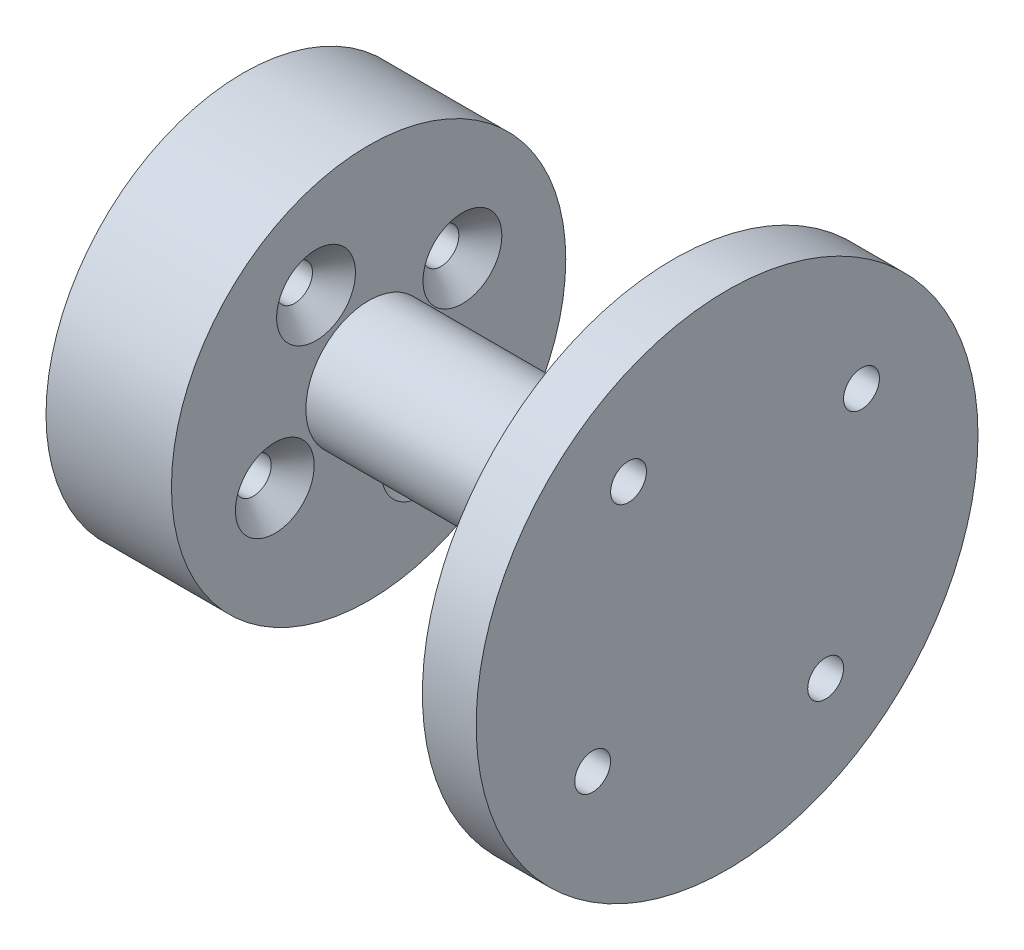
ISO-10303-21;
HEADER;
FILE_DESCRIPTION(('STEP AP214'),'2;1');
FILE_NAME('part.step','',(''),(''),'','','');
FILE_SCHEMA(('AUTOMOTIVE_DESIGN { 1 0 10303 214 1 1 1 1 }'));
ENDSEC;
DATA;
#1=APPLICATION_CONTEXT('core data for automotive mechanical design processes');
#2=APPLICATION_PROTOCOL_DEFINITION('international standard','automotive_design',2000,#1);
#3=PRODUCT_CONTEXT('',#1,'mechanical');
#4=PRODUCT('Part','Part','',(#3));
#5=PRODUCT_RELATED_PRODUCT_CATEGORY('part','',(#4));
#6=PRODUCT_DEFINITION_FORMATION('','',#4);
#7=PRODUCT_DEFINITION_CONTEXT('part definition',#1,'design');
#8=PRODUCT_DEFINITION('design','',#6,#7);
#9=PRODUCT_DEFINITION_SHAPE('','',#8);
#10=(LENGTH_UNIT() NAMED_UNIT(*) SI_UNIT(.MILLI.,.METRE.));
#11=(NAMED_UNIT(*) PLANE_ANGLE_UNIT() SI_UNIT($,.RADIAN.));
#12=(NAMED_UNIT(*) SI_UNIT($,.STERADIAN.) SOLID_ANGLE_UNIT());
#13=UNCERTAINTY_MEASURE_WITH_UNIT(LENGTH_MEASURE(1.E-05),#10,'distance_accuracy_value','');
#14=(GEOMETRIC_REPRESENTATION_CONTEXT(3) GLOBAL_UNCERTAINTY_ASSIGNED_CONTEXT((#13)) GLOBAL_UNIT_ASSIGNED_CONTEXT((#10,
#11,#12)) REPRESENTATION_CONTEXT('',''));
#15=CARTESIAN_POINT('',(0.,0.,0.));
#16=DIRECTION('',(0.,0.,1.));
#17=DIRECTION('',(1.,0.,0.));
#18=AXIS2_PLACEMENT_3D('',#15,#16,#17);
#19=CARTESIAN_POINT('',(0.,0.,0.));
#20=DIRECTION('',(-1.,0.,0.));
#21=DIRECTION('',(0.,0.,1.));
#22=AXIS2_PLACEMENT_3D('',#19,#20,#21);
#23=CYLINDRICAL_SURFACE('',#22,10.);
#24=CARTESIAN_POINT('',(4.,0.,0.));
#25=DIRECTION('',(-1.,0.,0.));
#26=DIRECTION('',(0.,0.,1.));
#27=AXIS2_PLACEMENT_3D('',#24,#25,#26);
#28=CIRCLE('',#27,10.);
#29=CARTESIAN_POINT('',(4.,0.,10.));
#30=VERTEX_POINT('',#29);
#31=EDGE_CURVE('E55',#30,#30,#28,.T.);
#32=ORIENTED_EDGE('',*,*,#31,.F.);
#33=EDGE_LOOP('',(#32));
#34=FACE_BOUND('',#33,.T.);
#35=CARTESIAN_POINT('',(0.,0.,0.));
#36=DIRECTION('',(-1.,0.,0.));
#37=DIRECTION('',(0.,0.,1.));
#38=AXIS2_PLACEMENT_3D('',#35,#36,#37);
#39=CIRCLE('',#38,10.);
#40=CARTESIAN_POINT('',(0.,0.,10.));
#41=VERTEX_POINT('',#40);
#42=EDGE_CURVE('E39',#41,#41,#39,.T.);
#43=ORIENTED_EDGE('',*,*,#42,.T.);
#44=EDGE_LOOP('',(#43));
#45=FACE_BOUND('',#44,.T.);
#46=ADVANCED_FACE('F33',(#34,#45),#23,.F.);
#47=CARTESIAN_POINT('',(0.,10.,0.));
#48=DIRECTION('',(1.,0.,0.));
#49=DIRECTION('',(0.,0.,-1.));
#50=AXIS2_PLACEMENT_3D('',#47,#48,#49);
#51=PLANE('',#50);
#52=ORIENTED_EDGE('',*,*,#42,.F.);
#53=EDGE_LOOP('',(#52));
#54=FACE_BOUND('',#53,.T.);
#55=CARTESIAN_POINT('',(0.,0.,0.));
#56=DIRECTION('',(-1.,0.,0.));
#57=DIRECTION('',(0.,0.,1.));
#58=AXIS2_PLACEMENT_3D('',#55,#56,#57);
#59=CIRCLE('',#58,11.);
#60=CARTESIAN_POINT('',(0.,0.,11.));
#61=VERTEX_POINT('',#60);
#62=EDGE_CURVE('E43',#61,#61,#59,.T.);
#63=ORIENTED_EDGE('',*,*,#62,.T.);
#64=EDGE_LOOP('',(#63));
#65=FACE_BOUND('',#64,.T.);
#66=ADVANCED_FACE('F111',(#54,#65),#51,.F.);
#67=CARTESIAN_POINT('',(0.,0.,0.));
#68=DIRECTION('',(-1.,0.,0.));
#69=DIRECTION('',(0.,0.,1.));
#70=AXIS2_PLACEMENT_3D('',#67,#68,#69);
#71=CYLINDRICAL_SURFACE('',#70,11.);
#72=ORIENTED_EDGE('',*,*,#62,.F.);
#73=EDGE_LOOP('',(#72));
#74=FACE_BOUND('',#73,.T.);
#75=CARTESIAN_POINT('',(7.,0.,0.));
#76=DIRECTION('',(-1.,0.,0.));
#77=DIRECTION('',(0.,0.,1.));
#78=AXIS2_PLACEMENT_3D('',#75,#76,#77);
#79=CIRCLE('',#78,11.);
#80=CARTESIAN_POINT('',(7.,0.,11.));
#81=VERTEX_POINT('',#80);
#82=EDGE_CURVE('E48',#81,#81,#79,.T.);
#83=ORIENTED_EDGE('',*,*,#82,.T.);
#84=EDGE_LOOP('',(#83));
#85=FACE_BOUND('',#84,.T.);
#86=ADVANCED_FACE('F98',(#74,#85),#71,.T.);
#87=CARTESIAN_POINT('',(7.,0.,0.));
#88=DIRECTION('',(-1.,0.,0.));
#89=DIRECTION('',(0.,0.,1.));
#90=AXIS2_PLACEMENT_3D('',#87,#88,#89);
#91=PLANE('',#90);
#92=CARTESIAN_POINT('',(7.,0.,0.));
#93=DIRECTION('',(-1.,0.,0.));
#94=DIRECTION('',(0.,0.,1.));
#95=AXIS2_PLACEMENT_3D('',#92,#93,#94);
#96=CIRCLE('',#95,3.5);
#97=CARTESIAN_POINT('',(7.,0.,3.5));
#98=VERTEX_POINT('',#97);
#99=EDGE_CURVE('E10',#98,#98,#96,.F.);
#100=ORIENTED_EDGE('',*,*,#99,.F.);
#101=EDGE_LOOP('',(#100));
#102=FACE_BOUND('',#101,.T.);
#103=CARTESIAN_POINT('',(7.,-2.93338314159258,5.23404846601753));
#104=DIRECTION('',(1.,0.,0.));
#105=DIRECTION('',(0.,0.,-1.));
#106=AXIS2_PLACEMENT_3D('',#103,#104,#105);
#107=CIRCLE('',#106,2.2);
#108=CARTESIAN_POINT('',(7.,-2.93338314159258,3.03404846601753));
#109=VERTEX_POINT('',#108);
#110=EDGE_CURVE('E75',#109,#109,#107,.T.);
#111=ORIENTED_EDGE('',*,*,#110,.F.);
#112=EDGE_LOOP('',(#111));
#113=FACE_BOUND('',#112,.T.);
#114=CARTESIAN_POINT('',(7.,-5.2340484660175,-2.93338314159263));
#115=DIRECTION('',(1.,0.,0.));
#116=DIRECTION('',(0.,0.,-1.));
#117=AXIS2_PLACEMENT_3D('',#114,#115,#116);
#118=CIRCLE('',#117,2.2);
#119=CARTESIAN_POINT('',(7.,-5.2340484660175,-5.13338314159263));
#120=VERTEX_POINT('',#119);
#121=EDGE_CURVE('E68',#120,#120,#118,.T.);
#122=ORIENTED_EDGE('',*,*,#121,.F.);
#123=EDGE_LOOP('',(#122));
#124=FACE_BOUND('',#123,.T.);
#125=CARTESIAN_POINT('',(7.,2.93338314159262,-5.23404846601751));
#126=DIRECTION('',(1.,0.,0.));
#127=DIRECTION('',(0.,0.,-1.));
#128=AXIS2_PLACEMENT_3D('',#125,#126,#127);
#129=CIRCLE('',#128,2.2);
#130=CARTESIAN_POINT('',(7.,2.93338314159262,-7.43404846601751));
#131=VERTEX_POINT('',#130);
#132=EDGE_CURVE('E64',#131,#131,#129,.T.);
#133=ORIENTED_EDGE('',*,*,#132,.F.);
#134=EDGE_LOOP('',(#133));
#135=FACE_BOUND('',#134,.T.);
#136=CARTESIAN_POINT('',(7.,5.2340484660175,2.93338314159263));
#137=DIRECTION('',(1.,0.,0.));
#138=DIRECTION('',(0.,0.,-1.));
#139=AXIS2_PLACEMENT_3D('',#136,#137,#138);
#140=CIRCLE('',#139,2.2);
#141=CARTESIAN_POINT('',(7.,5.2340484660175,0.733383141592633));
#142=VERTEX_POINT('',#141);
#143=EDGE_CURVE('E60',#142,#142,#140,.T.);
#144=ORIENTED_EDGE('',*,*,#143,.F.);
#145=EDGE_LOOP('',(#144));
#146=FACE_BOUND('',#145,.T.);
#147=ORIENTED_EDGE('',*,*,#82,.F.);
#148=EDGE_LOOP('',(#147));
#149=FACE_BOUND('',#148,.T.);
#150=ADVANCED_FACE('F100',(#102,#113,#124,#135,#146,#149),#91,.F.);
#151=CARTESIAN_POINT('',(4.,10.,0.));
#152=DIRECTION('',(1.,0.,0.));
#153=DIRECTION('',(0.,0.,-1.));
#154=AXIS2_PLACEMENT_3D('',#151,#152,#153);
#155=PLANE('',#154);
#156=CARTESIAN_POINT('',(4.,-2.93338314159258,5.23404846601753));
#157=DIRECTION('',(1.,0.,0.));
#158=DIRECTION('',(0.,0.,-1.));
#159=AXIS2_PLACEMENT_3D('',#156,#157,#158);
#160=CIRCLE('',#159,0.999999999999998);
#161=CARTESIAN_POINT('',(4.,-2.93338314159258,4.23404846601753));
#162=VERTEX_POINT('',#161);
#163=EDGE_CURVE('E66',#162,#162,#160,.T.);
#164=ORIENTED_EDGE('',*,*,#163,.T.);
#165=EDGE_LOOP('',(#164));
#166=FACE_BOUND('',#165,.T.);
#167=CARTESIAN_POINT('',(4.,-5.2340484660175,-2.93338314159263));
#168=DIRECTION('',(1.,0.,0.));
#169=DIRECTION('',(0.,0.,-1.));
#170=AXIS2_PLACEMENT_3D('',#167,#168,#169);
#171=CIRCLE('',#170,0.999999999999998);
#172=CARTESIAN_POINT('',(4.,-5.2340484660175,-3.93338314159263));
#173=VERTEX_POINT('',#172);
#174=EDGE_CURVE('E62',#173,#173,#171,.T.);
#175=ORIENTED_EDGE('',*,*,#174,.T.);
#176=EDGE_LOOP('',(#175));
#177=FACE_BOUND('',#176,.T.);
#178=CARTESIAN_POINT('',(4.,2.93338314159262,-5.23404846601751));
#179=DIRECTION('',(1.,0.,0.));
#180=DIRECTION('',(0.,0.,-1.));
#181=AXIS2_PLACEMENT_3D('',#178,#179,#180);
#182=CIRCLE('',#181,0.999999999999998);
#183=CARTESIAN_POINT('',(4.,2.93338314159262,-6.23404846601751));
#184=VERTEX_POINT('',#183);
#185=EDGE_CURVE('E57',#184,#184,#182,.T.);
#186=ORIENTED_EDGE('',*,*,#185,.T.);
#187=EDGE_LOOP('',(#186));
#188=FACE_BOUND('',#187,.T.);
#189=CARTESIAN_POINT('',(4.,5.2340484660175,2.93338314159263));
#190=DIRECTION('',(1.,0.,0.));
#191=DIRECTION('',(0.,0.,-1.));
#192=AXIS2_PLACEMENT_3D('',#189,#190,#191);
#193=CIRCLE('',#192,0.999999999999998);
#194=CARTESIAN_POINT('',(4.,5.2340484660175,1.93338314159264));
#195=VERTEX_POINT('',#194);
#196=EDGE_CURVE('E52',#195,#195,#193,.T.);
#197=ORIENTED_EDGE('',*,*,#196,.T.);
#198=EDGE_LOOP('',(#197));
#199=FACE_BOUND('',#198,.T.);
#200=ORIENTED_EDGE('',*,*,#31,.T.);
#201=EDGE_LOOP('',(#200));
#202=FACE_BOUND('',#201,.T.);
#203=ADVANCED_FACE('F102',(#166,#177,#188,#199,#202),#155,.F.);
#204=CARTESIAN_POINT('',(7.,5.2340484660175,2.93338314159263));
#205=DIRECTION('',(1.,0.,0.));
#206=DIRECTION('',(0.,0.,-1.));
#207=AXIS2_PLACEMENT_3D('',#204,#205,#206);
#208=CYLINDRICAL_SURFACE('',#207,0.999999999999998);
#209=CARTESIAN_POINT('',(5.8,5.2340484660175,2.93338314159263));
#210=DIRECTION('',(1.,0.,0.));
#211=DIRECTION('',(0.,0.,-1.));
#212=AXIS2_PLACEMENT_3D('',#209,#210,#211);
#213=CIRCLE('',#212,0.999999999999998);
#214=CARTESIAN_POINT('',(5.8,5.2340484660175,1.93338314159264));
#215=VERTEX_POINT('',#214);
#216=EDGE_CURVE('E56',#215,#215,#213,.T.);
#217=ORIENTED_EDGE('',*,*,#216,.T.);
#218=EDGE_LOOP('',(#217));
#219=FACE_BOUND('',#218,.T.);
#220=ORIENTED_EDGE('',*,*,#196,.F.);
#221=EDGE_LOOP('',(#220));
#222=FACE_BOUND('',#221,.T.);
#223=ADVANCED_FACE('F109',(#219,#222),#208,.F.);
#224=CARTESIAN_POINT('',(7.,5.2340484660175,2.93338314159263));
#225=DIRECTION('',(1.,0.,0.));
#226=DIRECTION('',(0.,0.,-1.));
#227=AXIS2_PLACEMENT_3D('',#224,#225,#226);
#228=CONICAL_SURFACE('',#227,2.2,0.785398163397448);
#229=ORIENTED_EDGE('',*,*,#216,.F.);
#230=EDGE_LOOP('',(#229));
#231=FACE_BOUND('',#230,.T.);
#232=ORIENTED_EDGE('',*,*,#143,.T.);
#233=EDGE_LOOP('',(#232));
#234=FACE_BOUND('',#233,.T.);
#235=ADVANCED_FACE('F141',(#231,#234),#228,.F.);
#236=CARTESIAN_POINT('',(7.,2.93338314159262,-5.23404846601751));
#237=DIRECTION('',(1.,0.,0.));
#238=DIRECTION('',(0.,0.,-1.));
#239=AXIS2_PLACEMENT_3D('',#236,#237,#238);
#240=CYLINDRICAL_SURFACE('',#239,0.999999999999998);
#241=CARTESIAN_POINT('',(5.8,2.93338314159262,-5.23404846601751));
#242=DIRECTION('',(1.,0.,0.));
#243=DIRECTION('',(0.,0.,-1.));
#244=AXIS2_PLACEMENT_3D('',#241,#242,#243);
#245=CIRCLE('',#244,0.999999999999998);
#246=CARTESIAN_POINT('',(5.8,2.93338314159262,-6.23404846601751));
#247=VERTEX_POINT('',#246);
#248=EDGE_CURVE('E61',#247,#247,#245,.T.);
#249=ORIENTED_EDGE('',*,*,#248,.T.);
#250=EDGE_LOOP('',(#249));
#251=FACE_BOUND('',#250,.T.);
#252=ORIENTED_EDGE('',*,*,#185,.F.);
#253=EDGE_LOOP('',(#252));
#254=FACE_BOUND('',#253,.T.);
#255=ADVANCED_FACE('F152',(#251,#254),#240,.F.);
#256=CARTESIAN_POINT('',(7.,2.93338314159262,-5.23404846601751));
#257=DIRECTION('',(1.,0.,0.));
#258=DIRECTION('',(0.,0.,-1.));
#259=AXIS2_PLACEMENT_3D('',#256,#257,#258);
#260=CONICAL_SURFACE('',#259,2.2,0.785398163397448);
#261=ORIENTED_EDGE('',*,*,#248,.F.);
#262=EDGE_LOOP('',(#261));
#263=FACE_BOUND('',#262,.T.);
#264=ORIENTED_EDGE('',*,*,#132,.T.);
#265=EDGE_LOOP('',(#264));
#266=FACE_BOUND('',#265,.T.);
#267=ADVANCED_FACE('F167',(#263,#266),#260,.F.);
#268=CARTESIAN_POINT('',(7.,-5.2340484660175,-2.93338314159263));
#269=DIRECTION('',(1.,0.,0.));
#270=DIRECTION('',(0.,0.,-1.));
#271=AXIS2_PLACEMENT_3D('',#268,#269,#270);
#272=CYLINDRICAL_SURFACE('',#271,0.999999999999998);
#273=CARTESIAN_POINT('',(5.8,-5.2340484660175,-2.93338314159263));
#274=DIRECTION('',(1.,0.,0.));
#275=DIRECTION('',(0.,0.,-1.));
#276=AXIS2_PLACEMENT_3D('',#273,#274,#275);
#277=CIRCLE('',#276,0.999999999999998);
#278=CARTESIAN_POINT('',(5.8,-5.2340484660175,-3.93338314159263));
#279=VERTEX_POINT('',#278);
#280=EDGE_CURVE('E65',#279,#279,#277,.T.);
#281=ORIENTED_EDGE('',*,*,#280,.T.);
#282=EDGE_LOOP('',(#281));
#283=FACE_BOUND('',#282,.T.);
#284=ORIENTED_EDGE('',*,*,#174,.F.);
#285=EDGE_LOOP('',(#284));
#286=FACE_BOUND('',#285,.T.);
#287=ADVANCED_FACE('F177',(#283,#286),#272,.F.);
#288=CARTESIAN_POINT('',(7.,-5.2340484660175,-2.93338314159263));
#289=DIRECTION('',(1.,0.,0.));
#290=DIRECTION('',(0.,0.,-1.));
#291=AXIS2_PLACEMENT_3D('',#288,#289,#290);
#292=CONICAL_SURFACE('',#291,2.2,0.785398163397448);
#293=ORIENTED_EDGE('',*,*,#280,.F.);
#294=EDGE_LOOP('',(#293));
#295=FACE_BOUND('',#294,.T.);
#296=ORIENTED_EDGE('',*,*,#121,.T.);
#297=EDGE_LOOP('',(#296));
#298=FACE_BOUND('',#297,.T.);
#299=ADVANCED_FACE('F187',(#295,#298),#292,.F.);
#300=CARTESIAN_POINT('',(7.,-2.93338314159258,5.23404846601753));
#301=DIRECTION('',(1.,0.,0.));
#302=DIRECTION('',(0.,0.,-1.));
#303=AXIS2_PLACEMENT_3D('',#300,#301,#302);
#304=CYLINDRICAL_SURFACE('',#303,0.999999999999998);
#305=CARTESIAN_POINT('',(5.8,-2.93338314159258,5.23404846601753));
#306=DIRECTION('',(1.,0.,0.));
#307=DIRECTION('',(0.,0.,-1.));
#308=AXIS2_PLACEMENT_3D('',#305,#306,#307);
#309=CIRCLE('',#308,0.999999999999999);
#310=CARTESIAN_POINT('',(5.8,-2.93338314159258,4.23404846601753));
#311=VERTEX_POINT('',#310);
#312=EDGE_CURVE('E69',#311,#311,#309,.T.);
#313=ORIENTED_EDGE('',*,*,#312,.T.);
#314=EDGE_LOOP('',(#313));
#315=FACE_BOUND('',#314,.T.);
#316=ORIENTED_EDGE('',*,*,#163,.F.);
#317=EDGE_LOOP('',(#316));
#318=FACE_BOUND('',#317,.T.);
#319=ADVANCED_FACE('F197',(#315,#318),#304,.F.);
#320=CARTESIAN_POINT('',(7.,-2.93338314159258,5.23404846601753));
#321=DIRECTION('',(1.,0.,0.));
#322=DIRECTION('',(0.,0.,-1.));
#323=AXIS2_PLACEMENT_3D('',#320,#321,#322);
#324=CONICAL_SURFACE('',#323,2.2,0.785398163397448);
#325=ORIENTED_EDGE('',*,*,#312,.F.);
#326=EDGE_LOOP('',(#325));
#327=FACE_BOUND('',#326,.T.);
#328=ORIENTED_EDGE('',*,*,#110,.T.);
#329=EDGE_LOOP('',(#328));
#330=FACE_BOUND('',#329,.T.);
#331=ADVANCED_FACE('F207',(#327,#330),#324,.F.);
#332=CARTESIAN_POINT('',(24.,0.,0.));
#333=DIRECTION('',(-1.,0.,0.));
#334=DIRECTION('',(0.,0.,1.));
#335=AXIS2_PLACEMENT_3D('',#332,#333,#334);
#336=CYLINDRICAL_SURFACE('',#335,3.5);
#337=CARTESIAN_POINT('',(24.,0.,0.));
#338=DIRECTION('',(1.,0.,0.));
#339=DIRECTION('',(0.,0.,-1.));
#340=AXIS2_PLACEMENT_3D('',#337,#338,#339);
#341=CIRCLE('',#340,3.5);
#342=CARTESIAN_POINT('',(24.,0.,-3.5));
#343=VERTEX_POINT('',#342);
#344=EDGE_CURVE('E80',#343,#343,#341,.T.);
#345=ORIENTED_EDGE('',*,*,#344,.F.);
#346=EDGE_LOOP('',(#345));
#347=FACE_BOUND('',#346,.T.);
#348=ORIENTED_EDGE('',*,*,#99,.T.);
#349=EDGE_LOOP('',(#348));
#350=FACE_BOUND('',#349,.T.);
#351=ADVANCED_FACE('F215',(#347,#350),#336,.T.);
#352=CARTESIAN_POINT('',(27.,0.,0.));
#353=DIRECTION('',(-1.,0.,0.));
#354=DIRECTION('',(0.,0.,1.));
#355=AXIS2_PLACEMENT_3D('',#352,#353,#354);
#356=CYLINDRICAL_SURFACE('',#355,14.);
#357=CARTESIAN_POINT('',(27.,0.,0.));
#358=DIRECTION('',(1.,0.,0.));
#359=DIRECTION('',(0.,0.,-1.));
#360=AXIS2_PLACEMENT_3D('',#357,#358,#359);
#361=CIRCLE('',#360,14.);
#362=CARTESIAN_POINT('',(27.,0.,-14.));
#363=VERTEX_POINT('',#362);
#364=EDGE_CURVE('E332',#363,#363,#361,.T.);
#365=ORIENTED_EDGE('',*,*,#364,.F.);
#366=EDGE_LOOP('',(#365));
#367=FACE_BOUND('',#366,.T.);
#368=CARTESIAN_POINT('',(24.,0.,0.));
#369=DIRECTION('',(1.,0.,0.));
#370=DIRECTION('',(0.,0.,-1.));
#371=AXIS2_PLACEMENT_3D('',#368,#369,#370);
#372=CIRCLE('',#371,14.);
#373=CARTESIAN_POINT('',(24.,0.,-14.));
#374=VERTEX_POINT('',#373);
#375=EDGE_CURVE('E331',#374,#374,#372,.T.);
#376=ORIENTED_EDGE('',*,*,#375,.T.);
#377=EDGE_LOOP('',(#376));
#378=FACE_BOUND('',#377,.T.);
#379=ADVANCED_FACE('F229',(#367,#378),#356,.T.);
#380=CARTESIAN_POINT('',(27.,0.,0.));
#381=DIRECTION('',(1.,0.,0.));
#382=DIRECTION('',(0.,0.,-1.));
#383=AXIS2_PLACEMENT_3D('',#380,#381,#382);
#384=PLANE('',#383);
#385=CARTESIAN_POINT('',(27.,5.49909083394698,-7.50000000000002));
#386=DIRECTION('',(1.,0.,0.));
#387=DIRECTION('',(0.,-1.,0.));
#388=AXIS2_PLACEMENT_3D('',#385,#386,#387);
#389=CIRCLE('',#388,1.);
#390=CARTESIAN_POINT('',(27.,4.49909083394698,-7.50000000000002));
#391=VERTEX_POINT('',#390);
#392=EDGE_CURVE('E306',#391,#391,#389,.T.);
#393=ORIENTED_EDGE('',*,*,#392,.F.);
#394=EDGE_LOOP('',(#393));
#395=FACE_BOUND('',#394,.T.);
#396=CARTESIAN_POINT('',(27.,-7.5,-5.49909083394701));
#397=DIRECTION('',(1.,0.,0.));
#398=DIRECTION('',(0.,0.,1.));
#399=AXIS2_PLACEMENT_3D('',#396,#397,#398);
#400=CIRCLE('',#399,1.);
#401=CARTESIAN_POINT('',(27.,-7.5,-4.49909083394701));
#402=VERTEX_POINT('',#401);
#403=EDGE_CURVE('E310',#402,#402,#400,.T.);
#404=ORIENTED_EDGE('',*,*,#403,.F.);
#405=EDGE_LOOP('',(#404));
#406=FACE_BOUND('',#405,.T.);
#407=CARTESIAN_POINT('',(27.,-5.49909083394693,7.50000000000006));
#408=DIRECTION('',(1.,0.,0.));
#409=DIRECTION('',(0.,1.,0.));
#410=AXIS2_PLACEMENT_3D('',#407,#408,#409);
#411=CIRCLE('',#410,1.);
#412=CARTESIAN_POINT('',(27.,-4.49909083394693,7.50000000000005));
#413=VERTEX_POINT('',#412);
#414=EDGE_CURVE('E319',#413,#413,#411,.T.);
#415=ORIENTED_EDGE('',*,*,#414,.F.);
#416=EDGE_LOOP('',(#415));
#417=FACE_BOUND('',#416,.T.);
#418=CARTESIAN_POINT('',(27.,7.5,5.49909083394701));
#419=DIRECTION('',(1.,0.,0.));
#420=DIRECTION('',(0.,0.,-1.));
#421=AXIS2_PLACEMENT_3D('',#418,#419,#420);
#422=CIRCLE('',#421,1.);
#423=CARTESIAN_POINT('',(27.,7.5,4.49909083394701));
#424=VERTEX_POINT('',#423);
#425=EDGE_CURVE('E328',#424,#424,#422,.T.);
#426=ORIENTED_EDGE('',*,*,#425,.F.);
#427=EDGE_LOOP('',(#426));
#428=FACE_BOUND('',#427,.T.);
#429=ORIENTED_EDGE('',*,*,#364,.T.);
#430=EDGE_LOOP('',(#429));
#431=FACE_BOUND('',#430,.T.);
#432=ADVANCED_FACE('F239',(#395,#406,#417,#428,#431),#384,.T.);
#433=CARTESIAN_POINT('',(24.,0.,0.));
#434=DIRECTION('',(1.,0.,0.));
#435=DIRECTION('',(0.,0.,-1.));
#436=AXIS2_PLACEMENT_3D('',#433,#434,#435);
#437=PLANE('',#436);
#438=CARTESIAN_POINT('',(24.,5.49909083394698,-7.50000000000002));
#439=DIRECTION('',(1.,0.,0.));
#440=DIRECTION('',(0.,0.,-1.));
#441=AXIS2_PLACEMENT_3D('',#438,#439,#440);
#442=CIRCLE('',#441,1.);
#443=CARTESIAN_POINT('',(24.,5.49909083394698,-8.50000000000002));
#444=VERTEX_POINT('',#443);
#445=EDGE_CURVE('E309',#444,#444,#442,.F.);
#446=ORIENTED_EDGE('',*,*,#445,.F.);
#447=EDGE_LOOP('',(#446));
#448=FACE_BOUND('',#447,.T.);
#449=CARTESIAN_POINT('',(24.,-7.5,-5.49909083394701));
#450=DIRECTION('',(1.,0.,0.));
#451=DIRECTION('',(0.,0.,-1.));
#452=AXIS2_PLACEMENT_3D('',#449,#450,#451);
#453=CIRCLE('',#452,1.);
#454=CARTESIAN_POINT('',(24.,-7.5,-6.49909083394701));
#455=VERTEX_POINT('',#454);
#456=EDGE_CURVE('E315',#455,#455,#453,.F.);
#457=ORIENTED_EDGE('',*,*,#456,.F.);
#458=EDGE_LOOP('',(#457));
#459=FACE_BOUND('',#458,.T.);
#460=CARTESIAN_POINT('',(24.,-5.49909083394693,7.50000000000006));
#461=DIRECTION('',(1.,0.,0.));
#462=DIRECTION('',(0.,0.,-1.));
#463=AXIS2_PLACEMENT_3D('',#460,#461,#462);
#464=CIRCLE('',#463,1.);
#465=CARTESIAN_POINT('',(24.,-5.49909083394693,6.50000000000006));
#466=VERTEX_POINT('',#465);
#467=EDGE_CURVE('E321',#466,#466,#464,.F.);
#468=ORIENTED_EDGE('',*,*,#467,.F.);
#469=EDGE_LOOP('',(#468));
#470=FACE_BOUND('',#469,.T.);
#471=CARTESIAN_POINT('',(24.,7.5,5.49909083394701));
#472=DIRECTION('',(1.,0.,0.));
#473=DIRECTION('',(0.,0.,-1.));
#474=AXIS2_PLACEMENT_3D('',#471,#472,#473);
#475=CIRCLE('',#474,1.);
#476=CARTESIAN_POINT('',(24.,7.5,4.49909083394701));
#477=VERTEX_POINT('',#476);
#478=EDGE_CURVE('E312',#477,#477,#475,.F.);
#479=ORIENTED_EDGE('',*,*,#478,.F.);
#480=EDGE_LOOP('',(#479));
#481=FACE_BOUND('',#480,.T.);
#482=ORIENTED_EDGE('',*,*,#344,.T.);
#483=EDGE_LOOP('',(#482));
#484=FACE_BOUND('',#483,.T.);
#485=ORIENTED_EDGE('',*,*,#375,.F.);
#486=EDGE_LOOP('',(#485));
#487=FACE_BOUND('',#486,.T.);
#488=ADVANCED_FACE('F253',(#448,#459,#470,#481,#484,#487),#437,.F.);
#489=CARTESIAN_POINT('',(-0.001000000000001,7.5,5.49909083394701));
#490=DIRECTION('',(1.,0.,0.));
#491=DIRECTION('',(0.,0.,-1.));
#492=AXIS2_PLACEMENT_3D('',#489,#490,#491);
#493=CYLINDRICAL_SURFACE('',#492,1.);
#494=ORIENTED_EDGE('',*,*,#425,.T.);
#495=EDGE_LOOP('',(#494));
#496=FACE_BOUND('',#495,.T.);
#497=ORIENTED_EDGE('',*,*,#478,.T.);
#498=EDGE_LOOP('',(#497));
#499=FACE_BOUND('',#498,.T.);
#500=ADVANCED_FACE('F247',(#496,#499),#493,.F.);
#501=CARTESIAN_POINT('',(-0.001000000000001,-5.49909083394693,7.50000000000006));
#502=DIRECTION('',(1.,0.,0.));
#503=DIRECTION('',(0.,0.,-1.));
#504=AXIS2_PLACEMENT_3D('',#501,#502,#503);
#505=CYLINDRICAL_SURFACE('',#504,1.);
#506=ORIENTED_EDGE('',*,*,#414,.T.);
#507=EDGE_LOOP('',(#506));
#508=FACE_BOUND('',#507,.T.);
#509=ORIENTED_EDGE('',*,*,#467,.T.);
#510=EDGE_LOOP('',(#509));
#511=FACE_BOUND('',#510,.T.);
#512=ADVANCED_FACE('F252',(#508,#511),#505,.F.);
#513=CARTESIAN_POINT('',(-0.001000000000001,-7.5,-5.49909083394701));
#514=DIRECTION('',(1.,0.,0.));
#515=DIRECTION('',(0.,0.,-1.));
#516=AXIS2_PLACEMENT_3D('',#513,#514,#515);
#517=CYLINDRICAL_SURFACE('',#516,1.);
#518=ORIENTED_EDGE('',*,*,#403,.T.);
#519=EDGE_LOOP('',(#518));
#520=FACE_BOUND('',#519,.T.);
#521=ORIENTED_EDGE('',*,*,#456,.T.);
#522=EDGE_LOOP('',(#521));
#523=FACE_BOUND('',#522,.T.);
#524=ADVANCED_FACE('F279',(#520,#523),#517,.F.);
#525=CARTESIAN_POINT('',(-0.001000000000001,5.49909083394698,-7.50000000000002));
#526=DIRECTION('',(1.,0.,0.));
#527=DIRECTION('',(0.,0.,-1.));
#528=AXIS2_PLACEMENT_3D('',#525,#526,#527);
#529=CYLINDRICAL_SURFACE('',#528,1.);
#530=ORIENTED_EDGE('',*,*,#392,.T.);
#531=EDGE_LOOP('',(#530));
#532=FACE_BOUND('',#531,.T.);
#533=ORIENTED_EDGE('',*,*,#445,.T.);
#534=EDGE_LOOP('',(#533));
#535=FACE_BOUND('',#534,.T.);
#536=ADVANCED_FACE('F289',(#532,#535),#529,.F.);
#537=CLOSED_SHELL('',(#46,#66,#86,#150,#203,#223,#235,#255,#267,#287,#299,#319,#331,#351,#379,
#432,#488,#500,#512,#524,#536));
#538=MANIFOLD_SOLID_BREP('B2',#537);
#539=ADVANCED_BREP_SHAPE_REPRESENTATION('',(#18,#538),#14);
#540=SHAPE_DEFINITION_REPRESENTATION(#9,#539);
ENDSEC;
END-ISO-10303-21;
